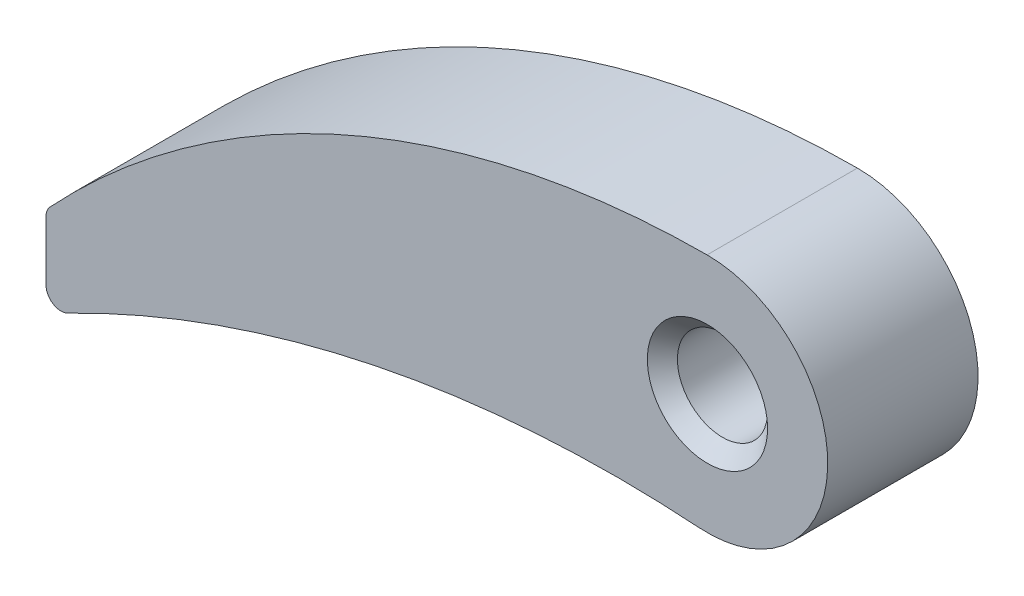
ISO-10303-21;
HEADER;
FILE_DESCRIPTION(('STEP AP214'),'2;1');
FILE_NAME('part.step','',(''),(''),'','','');
FILE_SCHEMA(('AUTOMOTIVE_DESIGN { 1 0 10303 214 1 1 1 1 }'));
ENDSEC;
DATA;
#1=APPLICATION_CONTEXT('core data for automotive mechanical design processes');
#2=APPLICATION_PROTOCOL_DEFINITION('international standard','automotive_design',2000,#1);
#3=PRODUCT_CONTEXT('',#1,'mechanical');
#4=PRODUCT('Part','Part','',(#3));
#5=PRODUCT_RELATED_PRODUCT_CATEGORY('part','',(#4));
#6=PRODUCT_DEFINITION_FORMATION('','',#4);
#7=PRODUCT_DEFINITION_CONTEXT('part definition',#1,'design');
#8=PRODUCT_DEFINITION('design','',#6,#7);
#9=PRODUCT_DEFINITION_SHAPE('','',#8);
#10=(LENGTH_UNIT() NAMED_UNIT(*) SI_UNIT(.MILLI.,.METRE.));
#11=(NAMED_UNIT(*) PLANE_ANGLE_UNIT() SI_UNIT($,.RADIAN.));
#12=(NAMED_UNIT(*) SI_UNIT($,.STERADIAN.) SOLID_ANGLE_UNIT());
#13=UNCERTAINTY_MEASURE_WITH_UNIT(LENGTH_MEASURE(1.E-05),#10,'distance_accuracy_value','');
#14=(GEOMETRIC_REPRESENTATION_CONTEXT(3) GLOBAL_UNCERTAINTY_ASSIGNED_CONTEXT((#13)) GLOBAL_UNIT_ASSIGNED_CONTEXT((#10,
#11,#12)) REPRESENTATION_CONTEXT('',''));
#15=CARTESIAN_POINT('',(0.,0.,0.));
#16=DIRECTION('',(0.,0.,1.));
#17=DIRECTION('',(1.,0.,0.));
#18=AXIS2_PLACEMENT_3D('',#15,#16,#17);
#19=CARTESIAN_POINT('',(22.0811623039863,-0.999873320468535,2.5));
#20=DIRECTION('',(0.,0.,1.));
#21=DIRECTION('',(1.,0.,0.));
#22=AXIS2_PLACEMENT_3D('',#19,#20,#21);
#23=PLANE('',#22);
#24=CARTESIAN_POINT('',(22.,25.,2.5));
#25=DIRECTION('',(0.,0.,1.));
#26=DIRECTION('',(1.,0.,0.));
#27=AXIS2_PLACEMENT_3D('',#24,#25,#26);
#28=CIRCLE('',#27,2.);
#29=CARTESIAN_POINT('',(24.,25.,2.5));
#30=VERTEX_POINT('',#29);
#31=EDGE_CURVE('E144',#30,#30,#28,.F.);
#32=ORIENTED_EDGE('',*,*,#31,.T.);
#33=EDGE_LOOP('',(#32));
#34=FACE_BOUND('',#33,.T.);
#35=CARTESIAN_POINT('',(22.0811623039863,-0.999873320468535,2.5));
#36=DIRECTION('',(0.,0.,1.));
#37=DIRECTION('',(1.,0.,0.));
#38=AXIS2_PLACEMENT_3D('',#35,#36,#37);
#39=CIRCLE('',#38,30.);
#40=CARTESIAN_POINT('',(21.9875134916944,28.9999805108413,2.5));
#41=VERTEX_POINT('',#40);
#42=CARTESIAN_POINT('',(0.134217588067993,19.4532833463256,2.5));
#43=VERTEX_POINT('',#42);
#44=EDGE_CURVE('E134',#41,#43,#39,.T.);
#45=ORIENTED_EDGE('',*,*,#44,.T.);
#46=CARTESIAN_POINT('',(0.499999999999967,19.1123974018791,2.5));
#47=DIRECTION('',(0.,0.,1.));
#48=DIRECTION('',(1.,0.,0.));
#49=AXIS2_PLACEMENT_3D('',#46,#47,#48);
#50=CIRCLE('',#49,0.5);
#51=CARTESIAN_POINT('',(0.,19.1123974018791,2.5));
#52=VERTEX_POINT('',#51);
#53=EDGE_CURVE('E57',#43,#52,#50,.T.);
#54=ORIENTED_EDGE('',*,*,#53,.T.);
#55=DIRECTION('',(0.,-1.,0.));
#56=VECTOR('',#55,1.);
#57=CARTESIAN_POINT('',(0.,19.3083090527773,2.5));
#58=LINE('',#57,#56);
#59=CARTESIAN_POINT('',(0.,17.1363640089714,2.5));
#60=VERTEX_POINT('',#59);
#61=EDGE_CURVE('E109',#52,#60,#58,.T.);
#62=ORIENTED_EDGE('',*,*,#61,.T.);
#63=CARTESIAN_POINT('',(0.49999999999999,17.1363640089714,2.5));
#64=DIRECTION('',(0.,0.,1.));
#65=DIRECTION('',(1.,0.,0.));
#66=AXIS2_PLACEMENT_3D('',#63,#64,#65);
#67=CIRCLE('',#66,0.5);
#68=CARTESIAN_POINT('',(0.728263384204047,16.6915091703648,2.5));
#69=VERTEX_POINT('',#68);
#70=EDGE_CURVE('E64',#60,#69,#67,.T.);
#71=ORIENTED_EDGE('',*,*,#70,.T.);
#72=CARTESIAN_POINT('',(18.9893341205285,-18.8968779181639,2.5));
#73=DIRECTION('',(0.,0.,-1.));
#74=DIRECTION('',(1.,0.,0.));
#75=AXIS2_PLACEMENT_3D('',#72,#73,#74);
#76=CIRCLE('',#75,40.);
#77=CARTESIAN_POINT('',(21.7263031018662,21.0093747347124,2.5));
#78=VERTEX_POINT('',#77);
#79=EDGE_CURVE('E102',#69,#78,#76,.T.);
#80=ORIENTED_EDGE('',*,*,#79,.T.);
#81=CARTESIAN_POINT('',(22.,25.,2.5));
#82=DIRECTION('',(0.,0.,1.));
#83=DIRECTION('',(1.,0.,0.));
#84=AXIS2_PLACEMENT_3D('',#81,#82,#83);
#85=CIRCLE('',#84,3.99999999999999);
#86=EDGE_CURVE('E105',#78,#41,#85,.T.);
#87=ORIENTED_EDGE('',*,*,#86,.T.);
#88=EDGE_LOOP('',(#45,#54,#62,#71,#80,#87));
#89=FACE_BOUND('',#88,.T.);
#90=ADVANCED_FACE('F49',(#34,#89),#23,.T.);
#91=CARTESIAN_POINT('',(22.0811623039863,-0.999873320468535,-2.5));
#92=DIRECTION('',(0.,0.,1.));
#93=DIRECTION('',(1.,0.,0.));
#94=AXIS2_PLACEMENT_3D('',#91,#92,#93);
#95=PLANE('',#94);
#96=CARTESIAN_POINT('',(22.,25.,-2.5));
#97=DIRECTION('',(0.,0.,1.));
#98=DIRECTION('',(1.,0.,0.));
#99=AXIS2_PLACEMENT_3D('',#96,#97,#98);
#100=CIRCLE('',#99,1.99999999999999);
#101=CARTESIAN_POINT('',(24.,25.,-2.5));
#102=VERTEX_POINT('',#101);
#103=EDGE_CURVE('E118',#102,#102,#100,.T.);
#104=ORIENTED_EDGE('',*,*,#103,.T.);
#105=EDGE_LOOP('',(#104));
#106=FACE_BOUND('',#105,.T.);
#107=DIRECTION('',(0.,-1.,0.));
#108=VECTOR('',#107,1.);
#109=CARTESIAN_POINT('',(0.,19.3083090527773,-2.5));
#110=LINE('',#109,#108);
#111=CARTESIAN_POINT('',(0.,19.1123974018791,-2.5));
#112=VERTEX_POINT('',#111);
#113=CARTESIAN_POINT('',(0.,17.1363640089714,-2.5));
#114=VERTEX_POINT('',#113);
#115=EDGE_CURVE('E129',#112,#114,#110,.T.);
#116=ORIENTED_EDGE('',*,*,#115,.F.);
#117=CARTESIAN_POINT('',(0.499999999999967,19.1123974018791,-2.5));
#118=DIRECTION('',(0.,0.,1.));
#119=DIRECTION('',(1.,0.,0.));
#120=AXIS2_PLACEMENT_3D('',#117,#118,#119);
#121=CIRCLE('',#120,0.5);
#122=CARTESIAN_POINT('',(0.134217588067993,19.4532833463256,-2.5));
#123=VERTEX_POINT('',#122);
#124=EDGE_CURVE('E154',#112,#123,#121,.F.);
#125=ORIENTED_EDGE('',*,*,#124,.T.);
#126=CARTESIAN_POINT('',(22.0811623039863,-0.999873320468535,-2.5));
#127=DIRECTION('',(0.,0.,1.));
#128=DIRECTION('',(1.,0.,0.));
#129=AXIS2_PLACEMENT_3D('',#126,#127,#128);
#130=CIRCLE('',#129,30.);
#131=CARTESIAN_POINT('',(21.9875134916944,28.9999805108413,-2.5));
#132=VERTEX_POINT('',#131);
#133=EDGE_CURVE('E127',#132,#123,#130,.T.);
#134=ORIENTED_EDGE('',*,*,#133,.F.);
#135=CARTESIAN_POINT('',(22.,25.,-2.5));
#136=DIRECTION('',(0.,0.,1.));
#137=DIRECTION('',(1.,0.,0.));
#138=AXIS2_PLACEMENT_3D('',#135,#136,#137);
#139=CIRCLE('',#138,3.99999999999999);
#140=CARTESIAN_POINT('',(21.7263031018662,21.0093747347124,-2.5));
#141=VERTEX_POINT('',#140);
#142=EDGE_CURVE('E133',#141,#132,#139,.T.);
#143=ORIENTED_EDGE('',*,*,#142,.F.);
#144=CARTESIAN_POINT('',(18.9893341205285,-18.8968779181639,-2.5));
#145=DIRECTION('',(0.,0.,-1.));
#146=DIRECTION('',(1.,0.,0.));
#147=AXIS2_PLACEMENT_3D('',#144,#145,#146);
#148=CIRCLE('',#147,40.);
#149=CARTESIAN_POINT('',(0.728263384204047,16.6915091703648,-2.5));
#150=VERTEX_POINT('',#149);
#151=EDGE_CURVE('E115',#150,#141,#148,.T.);
#152=ORIENTED_EDGE('',*,*,#151,.F.);
#153=CARTESIAN_POINT('',(0.49999999999999,17.1363640089714,-2.5));
#154=DIRECTION('',(0.,0.,1.));
#155=DIRECTION('',(1.,0.,0.));
#156=AXIS2_PLACEMENT_3D('',#153,#154,#155);
#157=CIRCLE('',#156,0.5);
#158=EDGE_CURVE('E152',#150,#114,#157,.F.);
#159=ORIENTED_EDGE('',*,*,#158,.T.);
#160=EDGE_LOOP('',(#116,#125,#134,#143,#152,#159));
#161=FACE_BOUND('',#160,.T.);
#162=ADVANCED_FACE('F168',(#106,#161),#95,.F.);
#163=CARTESIAN_POINT('',(22.0811623039863,-0.999873320468535,2.5));
#164=DIRECTION('',(0.,0.,-1.));
#165=DIRECTION('',(-1.,0.,0.));
#166=AXIS2_PLACEMENT_3D('',#163,#164,#165);
#167=CYLINDRICAL_SURFACE('',#166,30.);
#168=ORIENTED_EDGE('',*,*,#133,.T.);
#169=DIRECTION('',(0.,0.,-1.));
#170=VECTOR('',#169,1.);
#171=CARTESIAN_POINT('',(0.134217588067993,19.4532833463256,2.5));
#172=LINE('',#171,#170);
#173=EDGE_CURVE('E72',#123,#43,#172,.F.);
#174=ORIENTED_EDGE('',*,*,#173,.T.);
#175=ORIENTED_EDGE('',*,*,#44,.F.);
#176=DIRECTION('',(0.,0.,-1.));
#177=VECTOR('',#176,1.);
#178=CARTESIAN_POINT('',(21.9875134916944,28.9999805108413,2.5));
#179=LINE('',#178,#177);
#180=EDGE_CURVE('E119',#41,#132,#179,.T.);
#181=ORIENTED_EDGE('',*,*,#180,.T.);
#182=EDGE_LOOP('',(#168,#174,#175,#181));
#183=FACE_BOUND('',#182,.T.);
#184=ADVANCED_FACE('F169',(#183),#167,.T.);
#185=CARTESIAN_POINT('',(0.,19.3083090527773,2.5));
#186=DIRECTION('',(1.,0.,0.));
#187=DIRECTION('',(0.,1.,0.));
#188=AXIS2_PLACEMENT_3D('',#185,#186,#187);
#189=PLANE('',#188);
#190=ORIENTED_EDGE('',*,*,#61,.F.);
#191=DIRECTION('',(0.,0.,-1.));
#192=VECTOR('',#191,1.);
#193=CARTESIAN_POINT('',(0.,19.1123974018791,2.5));
#194=LINE('',#193,#192);
#195=EDGE_CURVE('E149',#52,#112,#194,.T.);
#196=ORIENTED_EDGE('',*,*,#195,.T.);
#197=ORIENTED_EDGE('',*,*,#115,.T.);
#198=DIRECTION('',(0.,0.,-1.));
#199=VECTOR('',#198,1.);
#200=CARTESIAN_POINT('',(0.,17.1363640089714,2.5));
#201=LINE('',#200,#199);
#202=EDGE_CURVE('E147',#114,#60,#201,.F.);
#203=ORIENTED_EDGE('',*,*,#202,.T.);
#204=EDGE_LOOP('',(#190,#196,#197,#203));
#205=FACE_BOUND('',#204,.T.);
#206=ADVANCED_FACE('F162',(#205),#189,.F.);
#207=CARTESIAN_POINT('',(18.9893341205285,-18.8968779181639,2.5));
#208=DIRECTION('',(0.,0.,-1.));
#209=DIRECTION('',(-1.,0.,0.));
#210=AXIS2_PLACEMENT_3D('',#207,#208,#209);
#211=CYLINDRICAL_SURFACE('',#210,40.);
#212=ORIENTED_EDGE('',*,*,#79,.F.);
#213=DIRECTION('',(0.,0.,-1.));
#214=VECTOR('',#213,1.);
#215=CARTESIAN_POINT('',(0.728263384204047,16.6915091703648,2.5));
#216=LINE('',#215,#214);
#217=EDGE_CURVE('E11',#69,#150,#216,.T.);
#218=ORIENTED_EDGE('',*,*,#217,.T.);
#219=ORIENTED_EDGE('',*,*,#151,.T.);
#220=DIRECTION('',(0.,0.,-1.));
#221=VECTOR('',#220,1.);
#222=CARTESIAN_POINT('',(21.7263031018662,21.0093747347124,2.5));
#223=LINE('',#222,#221);
#224=EDGE_CURVE('E112',#78,#141,#223,.T.);
#225=ORIENTED_EDGE('',*,*,#224,.F.);
#226=EDGE_LOOP('',(#212,#218,#219,#225));
#227=FACE_BOUND('',#226,.T.);
#228=ADVANCED_FACE('F113',(#227),#211,.F.);
#229=CARTESIAN_POINT('',(22.,25.,2.5));
#230=DIRECTION('',(0.,0.,-1.));
#231=DIRECTION('',(-1.,0.,0.));
#232=AXIS2_PLACEMENT_3D('',#229,#230,#231);
#233=CYLINDRICAL_SURFACE('',#232,3.99999999999999);
#234=ORIENTED_EDGE('',*,*,#142,.T.);
#235=ORIENTED_EDGE('',*,*,#180,.F.);
#236=ORIENTED_EDGE('',*,*,#86,.F.);
#237=ORIENTED_EDGE('',*,*,#224,.T.);
#238=EDGE_LOOP('',(#234,#235,#236,#237));
#239=FACE_BOUND('',#238,.T.);
#240=ADVANCED_FACE('F121',(#239),#233,.T.);
#241=CARTESIAN_POINT('',(22.,25.,2.5));
#242=DIRECTION('',(0.,0.,-1.));
#243=DIRECTION('',(-1.,0.,0.));
#244=AXIS2_PLACEMENT_3D('',#241,#242,#243);
#245=CYLINDRICAL_SURFACE('',#244,1.5);
#246=CARTESIAN_POINT('',(22.,25.,-2.));
#247=DIRECTION('',(0.,0.,1.));
#248=DIRECTION('',(1.,0.,0.));
#249=AXIS2_PLACEMENT_3D('',#246,#247,#248);
#250=CIRCLE('',#249,1.5);
#251=CARTESIAN_POINT('',(23.5,25.,-2.));
#252=VERTEX_POINT('',#251);
#253=EDGE_CURVE('E141',#252,#252,#250,.F.);
#254=ORIENTED_EDGE('',*,*,#253,.T.);
#255=EDGE_LOOP('',(#254));
#256=FACE_BOUND('',#255,.T.);
#257=CARTESIAN_POINT('',(22.,25.,2.));
#258=DIRECTION('',(0.,0.,1.));
#259=DIRECTION('',(1.,0.,0.));
#260=AXIS2_PLACEMENT_3D('',#257,#258,#259);
#261=CIRCLE('',#260,1.5);
#262=CARTESIAN_POINT('',(23.5,25.,2.));
#263=VERTEX_POINT('',#262);
#264=EDGE_CURVE('E138',#263,#263,#261,.T.);
#265=ORIENTED_EDGE('',*,*,#264,.T.);
#266=EDGE_LOOP('',(#265));
#267=FACE_BOUND('',#266,.T.);
#268=ADVANCED_FACE('F187',(#256,#267),#245,.F.);
#269=CARTESIAN_POINT('',(22.,25.,-2.5));
#270=DIRECTION('',(0.,0.,-1.));
#271=DIRECTION('',(-1.,0.,0.));
#272=AXIS2_PLACEMENT_3D('',#269,#270,#271);
#273=CONICAL_SURFACE('',#272,1.99999999999999,0.785398163397439);
#274=ORIENTED_EDGE('',*,*,#253,.F.);
#275=EDGE_LOOP('',(#274));
#276=FACE_BOUND('',#275,.T.);
#277=ORIENTED_EDGE('',*,*,#103,.F.);
#278=EDGE_LOOP('',(#277));
#279=FACE_BOUND('',#278,.T.);
#280=ADVANCED_FACE('F205',(#276,#279),#273,.F.);
#281=CARTESIAN_POINT('',(22.,25.,2.));
#282=DIRECTION('',(0.,0.,1.));
#283=DIRECTION('',(1.,0.,0.));
#284=AXIS2_PLACEMENT_3D('',#281,#282,#283);
#285=CONICAL_SURFACE('',#284,1.5,0.78539816339745);
#286=ORIENTED_EDGE('',*,*,#31,.F.);
#287=EDGE_LOOP('',(#286));
#288=FACE_BOUND('',#287,.T.);
#289=ORIENTED_EDGE('',*,*,#264,.F.);
#290=EDGE_LOOP('',(#289));
#291=FACE_BOUND('',#290,.T.);
#292=ADVANCED_FACE('F219',(#288,#291),#285,.F.);
#293=CARTESIAN_POINT('',(0.499999999999967,19.1123974018791,2.5));
#294=DIRECTION('',(0.,0.,-1.));
#295=DIRECTION('',(-1.,0.,0.));
#296=AXIS2_PLACEMENT_3D('',#293,#294,#295);
#297=CYLINDRICAL_SURFACE('',#296,0.5);
#298=ORIENTED_EDGE('',*,*,#53,.F.);
#299=ORIENTED_EDGE('',*,*,#173,.F.);
#300=ORIENTED_EDGE('',*,*,#124,.F.);
#301=ORIENTED_EDGE('',*,*,#195,.F.);
#302=EDGE_LOOP('',(#298,#299,#300,#301));
#303=FACE_BOUND('',#302,.T.);
#304=ADVANCED_FACE('F165',(#303),#297,.T.);
#305=CARTESIAN_POINT('',(0.49999999999999,17.1363640089714,2.5));
#306=DIRECTION('',(0.,0.,-1.));
#307=DIRECTION('',(-1.,0.,0.));
#308=AXIS2_PLACEMENT_3D('',#305,#306,#307);
#309=CYLINDRICAL_SURFACE('',#308,0.5);
#310=ORIENTED_EDGE('',*,*,#70,.F.);
#311=ORIENTED_EDGE('',*,*,#202,.F.);
#312=ORIENTED_EDGE('',*,*,#158,.F.);
#313=ORIENTED_EDGE('',*,*,#217,.F.);
#314=EDGE_LOOP('',(#310,#311,#312,#313));
#315=FACE_BOUND('',#314,.T.);
#316=ADVANCED_FACE('F51',(#315),#309,.T.);
#317=CLOSED_SHELL('',(#90,#162,#184,#206,#228,#240,#268,#280,#292,#304,#316));
#318=MANIFOLD_SOLID_BREP('B2',#317);
#319=ADVANCED_BREP_SHAPE_REPRESENTATION('',(#18,#318),#14);
#320=SHAPE_DEFINITION_REPRESENTATION(#9,#319);
ENDSEC;
END-ISO-10303-21;
